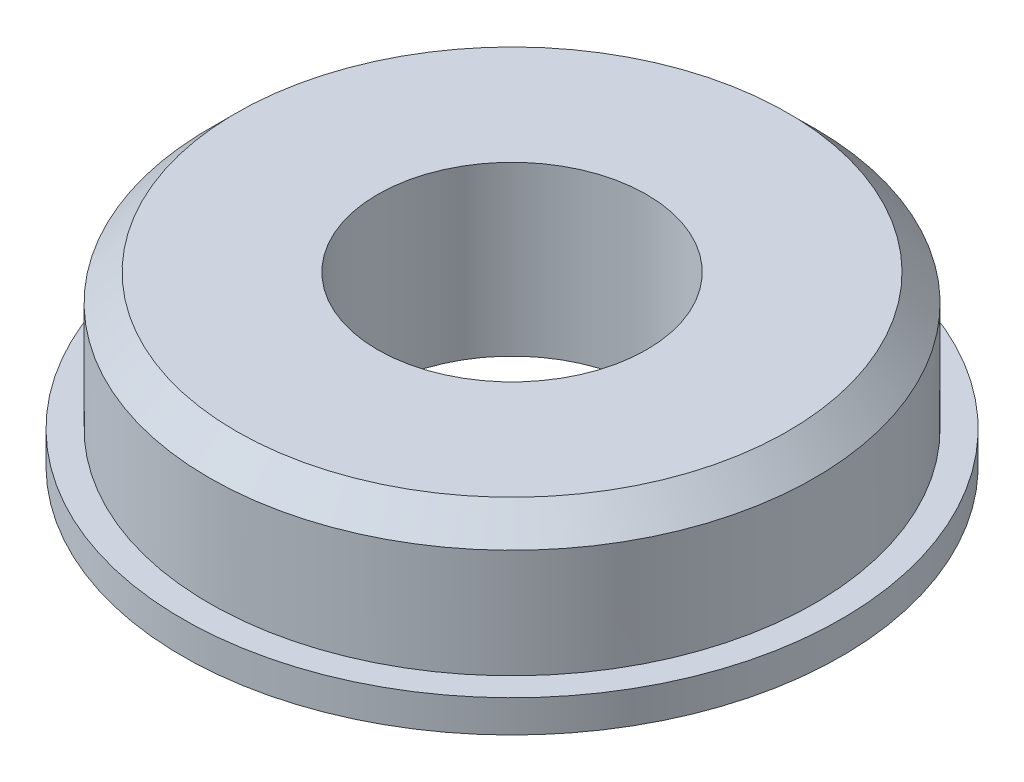
ISO-10303-21;
HEADER;
FILE_DESCRIPTION(('STEP AP214'),'2;1');
FILE_NAME('part.step','',(''),(''),'','','');
FILE_SCHEMA(('AUTOMOTIVE_DESIGN { 1 0 10303 214 1 1 1 1 }'));
ENDSEC;
DATA;
#1=APPLICATION_CONTEXT('core data for automotive mechanical design processes');
#2=APPLICATION_PROTOCOL_DEFINITION('international standard','automotive_design',2000,#1);
#3=PRODUCT_CONTEXT('',#1,'mechanical');
#4=PRODUCT('Part','Part','',(#3));
#5=PRODUCT_RELATED_PRODUCT_CATEGORY('part','',(#4));
#6=PRODUCT_DEFINITION_FORMATION('','',#4);
#7=PRODUCT_DEFINITION_CONTEXT('part definition',#1,'design');
#8=PRODUCT_DEFINITION('design','',#6,#7);
#9=PRODUCT_DEFINITION_SHAPE('','',#8);
#10=(LENGTH_UNIT() NAMED_UNIT(*) SI_UNIT(.MILLI.,.METRE.));
#11=(NAMED_UNIT(*) PLANE_ANGLE_UNIT() SI_UNIT($,.RADIAN.));
#12=(NAMED_UNIT(*) SI_UNIT($,.STERADIAN.) SOLID_ANGLE_UNIT());
#13=UNCERTAINTY_MEASURE_WITH_UNIT(LENGTH_MEASURE(1.E-05),#10,'distance_accuracy_value','');
#14=(GEOMETRIC_REPRESENTATION_CONTEXT(3) GLOBAL_UNCERTAINTY_ASSIGNED_CONTEXT((#13)) GLOBAL_UNIT_ASSIGNED_CONTEXT((#10,
#11,#12)) REPRESENTATION_CONTEXT('',''));
#15=CARTESIAN_POINT('',(0.,0.,0.));
#16=DIRECTION('',(0.,0.,1.));
#17=DIRECTION('',(1.,0.,0.));
#18=AXIS2_PLACEMENT_3D('',#15,#16,#17);
#19=CARTESIAN_POINT('',(0.,7.9248,0.));
#20=DIRECTION('',(0.,-1.,0.));
#21=DIRECTION('',(0.,0.,-1.));
#22=AXIS2_PLACEMENT_3D('',#19,#20,#21);
#23=CYLINDRICAL_SURFACE('',#22,14.2875);
#24=CARTESIAN_POINT('',(0.,6.6548,0.));
#25=DIRECTION('',(0.,1.,0.));
#26=DIRECTION('',(0.,0.,1.));
#27=AXIS2_PLACEMENT_3D('',#24,#25,#26);
#28=CIRCLE('',#27,14.2875);
#29=CARTESIAN_POINT('',(0.,6.6548,14.2875));
#30=VERTEX_POINT('',#29);
#31=EDGE_CURVE('E40',#30,#30,#28,.F.);
#32=ORIENTED_EDGE('',*,*,#31,.T.);
#33=EDGE_LOOP('',(#32));
#34=FACE_BOUND('',#33,.T.);
#35=CARTESIAN_POINT('',(0.,1.524,0.));
#36=DIRECTION('',(0.,-1.,0.));
#37=DIRECTION('',(0.,0.,-1.));
#38=AXIS2_PLACEMENT_3D('',#35,#36,#37);
#39=CIRCLE('',#38,14.2875);
#40=CARTESIAN_POINT('',(0.,1.524,-14.2875));
#41=VERTEX_POINT('',#40);
#42=EDGE_CURVE('E10',#41,#41,#39,.T.);
#43=ORIENTED_EDGE('',*,*,#42,.F.);
#44=EDGE_LOOP('',(#43));
#45=FACE_BOUND('',#44,.T.);
#46=ADVANCED_FACE('F36',(#34,#45),#23,.T.);
#47=CARTESIAN_POINT('',(0.,7.9248,0.));
#48=DIRECTION('',(0.,1.,0.));
#49=DIRECTION('',(0.,0.,1.));
#50=AXIS2_PLACEMENT_3D('',#47,#48,#49);
#51=PLANE('',#50);
#52=CARTESIAN_POINT('',(0.,7.9248,0.));
#53=DIRECTION('',(0.,1.,0.));
#54=DIRECTION('',(0.,0.,1.));
#55=AXIS2_PLACEMENT_3D('',#52,#53,#54);
#56=CIRCLE('',#55,13.0175);
#57=CARTESIAN_POINT('',(0.,7.9248,13.0175));
#58=VERTEX_POINT('',#57);
#59=EDGE_CURVE('E51',#58,#58,#56,.T.);
#60=ORIENTED_EDGE('',*,*,#59,.T.);
#61=EDGE_LOOP('',(#60));
#62=FACE_BOUND('',#61,.T.);
#63=CARTESIAN_POINT('',(0.,7.9248,0.));
#64=DIRECTION('',(0.,1.,0.));
#65=DIRECTION('',(0.,0.,1.));
#66=AXIS2_PLACEMENT_3D('',#63,#64,#65);
#67=CIRCLE('',#66,6.35);
#68=CARTESIAN_POINT('',(0.,7.9248,6.35));
#69=VERTEX_POINT('',#68);
#70=EDGE_CURVE('E56',#69,#69,#67,.T.);
#71=ORIENTED_EDGE('',*,*,#70,.F.);
#72=EDGE_LOOP('',(#71));
#73=FACE_BOUND('',#72,.T.);
#74=ADVANCED_FACE('F68',(#62,#73),#51,.T.);
#75=CARTESIAN_POINT('',(0.,0.,0.));
#76=DIRECTION('',(0.,1.,0.));
#77=DIRECTION('',(0.,0.,1.));
#78=AXIS2_PLACEMENT_3D('',#75,#76,#77);
#79=PLANE('',#78);
#80=CARTESIAN_POINT('',(0.,0.,0.));
#81=DIRECTION('',(0.,1.,0.));
#82=DIRECTION('',(0.,0.,1.));
#83=AXIS2_PLACEMENT_3D('',#80,#81,#82);
#84=CIRCLE('',#83,6.35);
#85=CARTESIAN_POINT('',(0.,0.,6.35));
#86=VERTEX_POINT('',#85);
#87=EDGE_CURVE('E60',#86,#86,#84,.T.);
#88=ORIENTED_EDGE('',*,*,#87,.T.);
#89=EDGE_LOOP('',(#88));
#90=FACE_BOUND('',#89,.T.);
#91=CARTESIAN_POINT('',(0.,0.,0.));
#92=DIRECTION('',(0.,-1.,0.));
#93=DIRECTION('',(0.,0.,-1.));
#94=AXIS2_PLACEMENT_3D('',#91,#92,#93);
#95=CIRCLE('',#94,15.5575);
#96=CARTESIAN_POINT('',(0.,0.,-15.5575));
#97=VERTEX_POINT('',#96);
#98=EDGE_CURVE('E54',#97,#97,#95,.T.);
#99=ORIENTED_EDGE('',*,*,#98,.T.);
#100=EDGE_LOOP('',(#99));
#101=FACE_BOUND('',#100,.T.);
#102=ADVANCED_FACE('F82',(#90,#101),#79,.F.);
#103=CARTESIAN_POINT('',(0.,7.9248,0.));
#104=DIRECTION('',(0.,-1.,0.));
#105=DIRECTION('',(0.,0.,-1.));
#106=AXIS2_PLACEMENT_3D('',#103,#104,#105);
#107=CYLINDRICAL_SURFACE('',#106,6.35);
#108=ORIENTED_EDGE('',*,*,#87,.F.);
#109=EDGE_LOOP('',(#108));
#110=FACE_BOUND('',#109,.T.);
#111=ORIENTED_EDGE('',*,*,#70,.T.);
#112=EDGE_LOOP('',(#111));
#113=FACE_BOUND('',#112,.T.);
#114=ADVANCED_FACE('F73',(#110,#113),#107,.F.);
#115=CARTESIAN_POINT('',(0.,7.9248,0.));
#116=DIRECTION('',(0.,-1.,0.));
#117=DIRECTION('',(0.,0.,-1.));
#118=AXIS2_PLACEMENT_3D('',#115,#116,#117);
#119=CONICAL_SURFACE('',#118,13.0175,0.785398163397447);
#120=ORIENTED_EDGE('',*,*,#31,.F.);
#121=EDGE_LOOP('',(#120));
#122=FACE_BOUND('',#121,.T.);
#123=ORIENTED_EDGE('',*,*,#59,.F.);
#124=EDGE_LOOP('',(#123));
#125=FACE_BOUND('',#124,.T.);
#126=ADVANCED_FACE('F38',(#122,#125),#119,.T.);
#127=CARTESIAN_POINT('',(0.,1.524,0.));
#128=DIRECTION('',(0.,-1.,0.));
#129=DIRECTION('',(0.,0.,-1.));
#130=AXIS2_PLACEMENT_3D('',#127,#128,#129);
#131=PLANE('',#130);
#132=CARTESIAN_POINT('',(0.,1.524,0.));
#133=DIRECTION('',(0.,-1.,0.));
#134=DIRECTION('',(0.,0.,-1.));
#135=AXIS2_PLACEMENT_3D('',#132,#133,#134);
#136=CIRCLE('',#135,15.5575);
#137=CARTESIAN_POINT('',(0.,1.524,-15.5575));
#138=VERTEX_POINT('',#137);
#139=EDGE_CURVE('E63',#138,#138,#136,.T.);
#140=ORIENTED_EDGE('',*,*,#139,.F.);
#141=EDGE_LOOP('',(#140));
#142=FACE_BOUND('',#141,.T.);
#143=ORIENTED_EDGE('',*,*,#42,.T.);
#144=EDGE_LOOP('',(#143));
#145=FACE_BOUND('',#144,.T.);
#146=ADVANCED_FACE('F72',(#142,#145),#131,.F.);
#147=CARTESIAN_POINT('',(0.,1.524,0.));
#148=DIRECTION('',(0.,-1.,0.));
#149=DIRECTION('',(0.,0.,-1.));
#150=AXIS2_PLACEMENT_3D('',#147,#148,#149);
#151=CYLINDRICAL_SURFACE('',#150,15.5575);
#152=CARTESIAN_POINT('',(0.,1.524,-15.5575));
#153=CARTESIAN_POINT('',(0.,1.508125,-15.5575));
#154=CARTESIAN_POINT('',(0.,1.49225,-15.5575));
#155=CARTESIAN_POINT('',(0.,1.4605,-15.5575));
#156=CARTESIAN_POINT('',(0.,1.444625,-15.5575));
#157=CARTESIAN_POINT('',(0.,1.412875,-15.5575));
#158=CARTESIAN_POINT('',(0.,1.397,-15.5575));
#159=CARTESIAN_POINT('',(0.,1.36525,-15.5575));
#160=CARTESIAN_POINT('',(0.,1.349375,-15.5575));
#161=CARTESIAN_POINT('',(0.,1.317625,-15.5575));
#162=CARTESIAN_POINT('',(0.,1.30175,-15.5575));
#163=CARTESIAN_POINT('',(0.,1.27,-15.5575));
#164=CARTESIAN_POINT('',(0.,1.254125,-15.5575));
#165=CARTESIAN_POINT('',(0.,1.222375,-15.5575));
#166=CARTESIAN_POINT('',(0.,1.2065,-15.5575));
#167=CARTESIAN_POINT('',(0.,1.17475,-15.5575));
#168=CARTESIAN_POINT('',(0.,1.158875,-15.5575));
#169=CARTESIAN_POINT('',(0.,1.127125,-15.5575));
#170=CARTESIAN_POINT('',(0.,1.11125,-15.5575));
#171=CARTESIAN_POINT('',(0.,1.0795,-15.5575));
#172=CARTESIAN_POINT('',(0.,1.063625,-15.5575));
#173=CARTESIAN_POINT('',(0.,1.031875,-15.5575));
#174=CARTESIAN_POINT('',(0.,1.016,-15.5575));
#175=CARTESIAN_POINT('',(0.,0.98425,-15.5575));
#176=CARTESIAN_POINT('',(0.,0.968375,-15.5575));
#177=CARTESIAN_POINT('',(0.,0.936625,-15.5575));
#178=CARTESIAN_POINT('',(0.,0.92075,-15.5575));
#179=CARTESIAN_POINT('',(0.,0.889,-15.5575));
#180=CARTESIAN_POINT('',(0.,0.873125,-15.5575));
#181=CARTESIAN_POINT('',(0.,0.841375,-15.5575));
#182=CARTESIAN_POINT('',(0.,0.8255,-15.5575));
#183=CARTESIAN_POINT('',(0.,0.79375,-15.5575));
#184=CARTESIAN_POINT('',(0.,0.777875,-15.5575));
#185=CARTESIAN_POINT('',(0.,0.746125,-15.5575));
#186=CARTESIAN_POINT('',(0.,0.73025,-15.5575));
#187=CARTESIAN_POINT('',(0.,0.6985,-15.5575));
#188=CARTESIAN_POINT('',(0.,0.682625,-15.5575));
#189=CARTESIAN_POINT('',(0.,0.650875,-15.5575));
#190=CARTESIAN_POINT('',(0.,0.635,-15.5575));
#191=CARTESIAN_POINT('',(0.,0.60325,-15.5575));
#192=CARTESIAN_POINT('',(0.,0.587375,-15.5575));
#193=CARTESIAN_POINT('',(0.,0.555625,-15.5575));
#194=CARTESIAN_POINT('',(0.,0.53975,-15.5575));
#195=CARTESIAN_POINT('',(0.,0.508,-15.5575));
#196=CARTESIAN_POINT('',(0.,0.492125,-15.5575));
#197=CARTESIAN_POINT('',(0.,0.460375,-15.5575));
#198=CARTESIAN_POINT('',(0.,0.4445,-15.5575));
#199=CARTESIAN_POINT('',(0.,0.41275,-15.5575));
#200=CARTESIAN_POINT('',(0.,0.396875,-15.5575));
#201=CARTESIAN_POINT('',(0.,0.365125,-15.5575));
#202=CARTESIAN_POINT('',(0.,0.34925,-15.5575));
#203=CARTESIAN_POINT('',(0.,0.3175,-15.5575));
#204=CARTESIAN_POINT('',(0.,0.301625,-15.5575));
#205=CARTESIAN_POINT('',(0.,0.269875,-15.5575));
#206=CARTESIAN_POINT('',(0.,0.254,-15.5575));
#207=CARTESIAN_POINT('',(0.,0.22225,-15.5575));
#208=CARTESIAN_POINT('',(0.,0.206375,-15.5575));
#209=CARTESIAN_POINT('',(0.,0.174625,-15.5575));
#210=CARTESIAN_POINT('',(0.,0.15875,-15.5575));
#211=CARTESIAN_POINT('',(0.,0.127,-15.5575));
#212=CARTESIAN_POINT('',(0.,0.111125,-15.5575));
#213=CARTESIAN_POINT('',(0.,0.079375,-15.5575));
#214=CARTESIAN_POINT('',(0.,0.0635,-15.5575));
#215=CARTESIAN_POINT('',(0.,0.0317499999999999,-15.5575));
#216=CARTESIAN_POINT('',(0.,0.015875,-15.5575));
#217=CARTESIAN_POINT('',(0.,0.,-15.5575));
#218=B_SPLINE_CURVE_WITH_KNOTS('',3,(#152,#153,#154,#155,#156,#157,#158,#159,#160,#161,#162,
#163,#164,#165,#166,#167,#168,#169,#170,#171,#172,#173,#174,#175,#176,#177,#178,#179,#180,#181,
#182,#183,#184,#185,#186,#187,#188,#189,#190,#191,#192,#193,#194,#195,#196,#197,#198,#199,#200,
#201,#202,#203,#204,#205,#206,#207,#208,#209,#210,#211,#212,#213,#214,#215,#216,#217),
.UNSPECIFIED.,.F.,.F.,(4,2,2,2,2,2,2,2,2,2,2,2,2,2,2,2,2,2,2,2,2,2,2,2,2,2,2,2,2,2,2,2,4),(0.,
0.0476249999999999,0.0952499999999998,0.142875,0.1905,0.238125,0.28575,0.333375,0.381,0.428625,
0.47625,0.523875,0.5715,0.619125,0.66675,0.714375,0.762,0.809625,0.85725,0.904875,0.9525,
1.000125,1.04775,1.095375,1.143,1.190625,1.23825,1.285875,1.3335,1.381125,1.42875,1.476375,
1.524),.UNSPECIFIED.);
#219=EDGE_CURVE('BSEAM79',#138,#97,#218,.T.);
#220=ORIENTED_EDGE('',*,*,#139,.T.);
#221=ORIENTED_EDGE('',*,*,#98,.F.);
#222=ORIENTED_EDGE('',*,*,#219,.T.);
#223=ORIENTED_EDGE('',*,*,#219,.F.);
#224=EDGE_LOOP('',(#220,#222,#221,#223));
#225=FACE_BOUND('',#224,.T.);
#226=ADVANCED_FACE('F79',(#225),#151,.T.);
#227=CLOSED_SHELL('',(#46,#74,#102,#114,#126,#146,#226));
#228=MANIFOLD_SOLID_BREP('B2',#227);
#229=ADVANCED_BREP_SHAPE_REPRESENTATION('',(#18,#228),#14);
#230=SHAPE_DEFINITION_REPRESENTATION(#9,#229);
ENDSEC;
END-ISO-10303-21;
